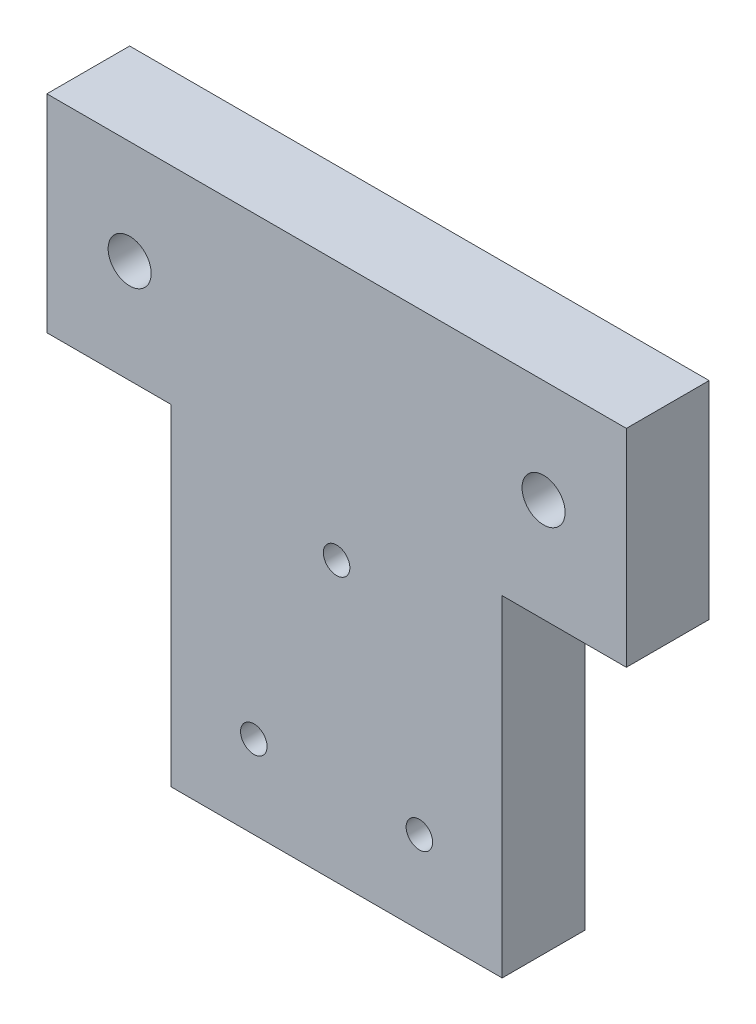
ISO-10303-21;
HEADER;
FILE_DESCRIPTION(('STEP AP214'),'2;1');
FILE_NAME('part.step','',(''),(''),'','','');
FILE_SCHEMA(('AUTOMOTIVE_DESIGN { 1 0 10303 214 1 1 1 1 }'));
ENDSEC;
DATA;
#1=APPLICATION_CONTEXT('core data for automotive mechanical design processes');
#2=APPLICATION_PROTOCOL_DEFINITION('international standard','automotive_design',2000,#1);
#3=PRODUCT_CONTEXT('',#1,'mechanical');
#4=PRODUCT('Part','Part','',(#3));
#5=PRODUCT_RELATED_PRODUCT_CATEGORY('part','',(#4));
#6=PRODUCT_DEFINITION_FORMATION('','',#4);
#7=PRODUCT_DEFINITION_CONTEXT('part definition',#1,'design');
#8=PRODUCT_DEFINITION('design','',#6,#7);
#9=PRODUCT_DEFINITION_SHAPE('','',#8);
#10=(LENGTH_UNIT() NAMED_UNIT(*) SI_UNIT(.MILLI.,.METRE.));
#11=(NAMED_UNIT(*) PLANE_ANGLE_UNIT() SI_UNIT($,.RADIAN.));
#12=(NAMED_UNIT(*) SI_UNIT($,.STERADIAN.) SOLID_ANGLE_UNIT());
#13=UNCERTAINTY_MEASURE_WITH_UNIT(LENGTH_MEASURE(1.E-05),#10,'distance_accuracy_value','');
#14=(GEOMETRIC_REPRESENTATION_CONTEXT(3) GLOBAL_UNCERTAINTY_ASSIGNED_CONTEXT((#13)) GLOBAL_UNIT_ASSIGNED_CONTEXT((#10,
#11,#12)) REPRESENTATION_CONTEXT('',''));
#15=CARTESIAN_POINT('',(0.,0.,0.));
#16=DIRECTION('',(0.,0.,1.));
#17=DIRECTION('',(1.,0.,0.));
#18=AXIS2_PLACEMENT_3D('',#15,#16,#17);
#19=CARTESIAN_POINT('',(-20.,-25.,10.));
#20=DIRECTION('',(1.,0.,0.));
#21=DIRECTION('',(0.,0.,-1.));
#22=AXIS2_PLACEMENT_3D('',#19,#20,#21);
#23=PLANE('',#22);
#24=DIRECTION('',(0.,-1.,0.));
#25=VECTOR('',#24,1.);
#26=CARTESIAN_POINT('',(-20.,-25.,0.));
#27=LINE('',#26,#25);
#28=CARTESIAN_POINT('',(-20.,-25.,0.));
#29=VERTEX_POINT('',#28);
#30=CARTESIAN_POINT('',(-20.,-65.,0.));
#31=VERTEX_POINT('',#30);
#32=EDGE_CURVE('E133',#29,#31,#27,.T.);
#33=ORIENTED_EDGE('',*,*,#32,.T.);
#34=DIRECTION('',(0.,0.,-1.));
#35=VECTOR('',#34,1.);
#36=CARTESIAN_POINT('',(-20.,-65.,10.));
#37=LINE('',#36,#35);
#38=CARTESIAN_POINT('',(-20.,-65.,10.));
#39=VERTEX_POINT('',#38);
#40=EDGE_CURVE('E11',#39,#31,#37,.T.);
#41=ORIENTED_EDGE('',*,*,#40,.F.);
#42=DIRECTION('',(0.,-1.,0.));
#43=VECTOR('',#42,1.);
#44=CARTESIAN_POINT('',(-20.,-25.,10.));
#45=LINE('',#44,#43);
#46=CARTESIAN_POINT('',(-20.,-25.,10.));
#47=VERTEX_POINT('',#46);
#48=EDGE_CURVE('E148',#47,#39,#45,.T.);
#49=ORIENTED_EDGE('',*,*,#48,.F.);
#50=DIRECTION('',(0.,0.,-1.));
#51=VECTOR('',#50,1.);
#52=CARTESIAN_POINT('',(-20.,-25.,10.));
#53=LINE('',#52,#51);
#54=EDGE_CURVE('E129',#47,#29,#53,.T.);
#55=ORIENTED_EDGE('',*,*,#54,.T.);
#56=EDGE_LOOP('',(#33,#41,#49,#55));
#57=FACE_BOUND('',#56,.T.);
#58=ADVANCED_FACE('F37',(#57),#23,.F.);
#59=CARTESIAN_POINT('',(20.,-65.,10.));
#60=DIRECTION('',(0.,1.,0.));
#61=DIRECTION('',(0.,0.,1.));
#62=AXIS2_PLACEMENT_3D('',#59,#60,#61);
#63=PLANE('',#62);
#64=DIRECTION('',(1.,0.,0.));
#65=VECTOR('',#64,1.);
#66=CARTESIAN_POINT('',(20.,-65.,0.));
#67=LINE('',#66,#65);
#68=CARTESIAN_POINT('',(20.,-65.,0.));
#69=VERTEX_POINT('',#68);
#70=EDGE_CURVE('E136',#31,#69,#67,.T.);
#71=ORIENTED_EDGE('',*,*,#70,.T.);
#72=DIRECTION('',(0.,0.,-1.));
#73=VECTOR('',#72,1.);
#74=CARTESIAN_POINT('',(20.,-65.,10.));
#75=LINE('',#74,#73);
#76=CARTESIAN_POINT('',(20.,-65.,10.));
#77=VERTEX_POINT('',#76);
#78=EDGE_CURVE('E45',#77,#69,#75,.T.);
#79=ORIENTED_EDGE('',*,*,#78,.F.);
#80=DIRECTION('',(1.,0.,0.));
#81=VECTOR('',#80,1.);
#82=CARTESIAN_POINT('',(20.,-65.,10.));
#83=LINE('',#82,#81);
#84=EDGE_CURVE('E96',#39,#77,#83,.T.);
#85=ORIENTED_EDGE('',*,*,#84,.F.);
#86=ORIENTED_EDGE('',*,*,#40,.T.);
#87=EDGE_LOOP('',(#71,#79,#85,#86));
#88=FACE_BOUND('',#87,.T.);
#89=ADVANCED_FACE('F241',(#88),#63,.F.);
#90=CARTESIAN_POINT('',(20.,-25.,10.));
#91=DIRECTION('',(-1.,0.,0.));
#92=DIRECTION('',(0.,0.,1.));
#93=AXIS2_PLACEMENT_3D('',#90,#91,#92);
#94=PLANE('',#93);
#95=DIRECTION('',(0.,1.,0.));
#96=VECTOR('',#95,1.);
#97=CARTESIAN_POINT('',(20.,-25.,0.));
#98=LINE('',#97,#96);
#99=CARTESIAN_POINT('',(20.,-25.,0.));
#100=VERTEX_POINT('',#99);
#101=EDGE_CURVE('E139',#69,#100,#98,.T.);
#102=ORIENTED_EDGE('',*,*,#101,.T.);
#103=DIRECTION('',(0.,0.,-1.));
#104=VECTOR('',#103,1.);
#105=CARTESIAN_POINT('',(20.,-25.,10.));
#106=LINE('',#105,#104);
#107=CARTESIAN_POINT('',(20.,-25.,10.));
#108=VERTEX_POINT('',#107);
#109=EDGE_CURVE('E155',#108,#100,#106,.T.);
#110=ORIENTED_EDGE('',*,*,#109,.F.);
#111=DIRECTION('',(0.,1.,0.));
#112=VECTOR('',#111,1.);
#113=CARTESIAN_POINT('',(20.,-25.,10.));
#114=LINE('',#113,#112);
#115=EDGE_CURVE('E163',#77,#108,#114,.T.);
#116=ORIENTED_EDGE('',*,*,#115,.F.);
#117=ORIENTED_EDGE('',*,*,#78,.T.);
#118=EDGE_LOOP('',(#102,#110,#116,#117));
#119=FACE_BOUND('',#118,.T.);
#120=ADVANCED_FACE('F161',(#119),#94,.F.);
#121=CARTESIAN_POINT('',(35.,-25.,10.));
#122=DIRECTION('',(0.,1.,0.));
#123=DIRECTION('',(-1.,0.,0.));
#124=AXIS2_PLACEMENT_3D('',#121,#122,#123);
#125=PLANE('',#124);
#126=DIRECTION('',(1.,0.,0.));
#127=VECTOR('',#126,1.);
#128=CARTESIAN_POINT('',(35.,-25.,0.));
#129=LINE('',#128,#127);
#130=CARTESIAN_POINT('',(35.,-25.,0.));
#131=VERTEX_POINT('',#130);
#132=EDGE_CURVE('E141',#100,#131,#129,.T.);
#133=ORIENTED_EDGE('',*,*,#132,.T.);
#134=DIRECTION('',(0.,0.,-1.));
#135=VECTOR('',#134,1.);
#136=CARTESIAN_POINT('',(35.,-25.,10.));
#137=LINE('',#136,#135);
#138=CARTESIAN_POINT('',(35.,-25.,10.));
#139=VERTEX_POINT('',#138);
#140=EDGE_CURVE('E152',#139,#131,#137,.T.);
#141=ORIENTED_EDGE('',*,*,#140,.F.);
#142=DIRECTION('',(1.,0.,0.));
#143=VECTOR('',#142,1.);
#144=CARTESIAN_POINT('',(35.,-25.,10.));
#145=LINE('',#144,#143);
#146=EDGE_CURVE('E175',#108,#139,#145,.T.);
#147=ORIENTED_EDGE('',*,*,#146,.F.);
#148=ORIENTED_EDGE('',*,*,#109,.T.);
#149=EDGE_LOOP('',(#133,#141,#147,#148));
#150=FACE_BOUND('',#149,.T.);
#151=ADVANCED_FACE('F171',(#150),#125,.F.);
#152=CARTESIAN_POINT('',(35.,0.,10.));
#153=DIRECTION('',(-1.,0.,0.));
#154=DIRECTION('',(0.,0.,1.));
#155=AXIS2_PLACEMENT_3D('',#152,#153,#154);
#156=PLANE('',#155);
#157=DIRECTION('',(0.,1.,0.));
#158=VECTOR('',#157,1.);
#159=CARTESIAN_POINT('',(35.,0.,0.));
#160=LINE('',#159,#158);
#161=CARTESIAN_POINT('',(35.,0.,0.));
#162=VERTEX_POINT('',#161);
#163=EDGE_CURVE('E143',#131,#162,#160,.T.);
#164=ORIENTED_EDGE('',*,*,#163,.T.);
#165=DIRECTION('',(0.,0.,-1.));
#166=VECTOR('',#165,1.);
#167=CARTESIAN_POINT('',(35.,0.,10.));
#168=LINE('',#167,#166);
#169=CARTESIAN_POINT('',(35.,0.,10.));
#170=VERTEX_POINT('',#169);
#171=EDGE_CURVE('E124',#170,#162,#168,.T.);
#172=ORIENTED_EDGE('',*,*,#171,.F.);
#173=DIRECTION('',(0.,1.,0.));
#174=VECTOR('',#173,1.);
#175=CARTESIAN_POINT('',(35.,0.,10.));
#176=LINE('',#175,#174);
#177=EDGE_CURVE('E115',#139,#170,#176,.T.);
#178=ORIENTED_EDGE('',*,*,#177,.F.);
#179=ORIENTED_EDGE('',*,*,#140,.T.);
#180=EDGE_LOOP('',(#164,#172,#178,#179));
#181=FACE_BOUND('',#180,.T.);
#182=ADVANCED_FACE('F174',(#181),#156,.F.);
#183=CARTESIAN_POINT('',(-35.,0.,10.));
#184=DIRECTION('',(0.,-1.,0.));
#185=DIRECTION('',(0.,0.,-1.));
#186=AXIS2_PLACEMENT_3D('',#183,#184,#185);
#187=PLANE('',#186);
#188=DIRECTION('',(-1.,0.,0.));
#189=VECTOR('',#188,1.);
#190=CARTESIAN_POINT('',(-35.,0.,0.));
#191=LINE('',#190,#189);
#192=CARTESIAN_POINT('',(-35.,0.,0.));
#193=VERTEX_POINT('',#192);
#194=EDGE_CURVE('E123',#162,#193,#191,.T.);
#195=ORIENTED_EDGE('',*,*,#194,.T.);
#196=DIRECTION('',(0.,0.,-1.));
#197=VECTOR('',#196,1.);
#198=CARTESIAN_POINT('',(-35.,0.,10.));
#199=LINE('',#198,#197);
#200=CARTESIAN_POINT('',(-35.,0.,10.));
#201=VERTEX_POINT('',#200);
#202=EDGE_CURVE('E120',#201,#193,#199,.T.);
#203=ORIENTED_EDGE('',*,*,#202,.F.);
#204=DIRECTION('',(-1.,0.,0.));
#205=VECTOR('',#204,1.);
#206=CARTESIAN_POINT('',(-35.,0.,10.));
#207=LINE('',#206,#205);
#208=EDGE_CURVE('E109',#170,#201,#207,.T.);
#209=ORIENTED_EDGE('',*,*,#208,.F.);
#210=ORIENTED_EDGE('',*,*,#171,.T.);
#211=EDGE_LOOP('',(#195,#203,#209,#210));
#212=FACE_BOUND('',#211,.T.);
#213=ADVANCED_FACE('F121',(#212),#187,.F.);
#214=CARTESIAN_POINT('',(-35.,0.,10.));
#215=DIRECTION('',(1.,0.,0.));
#216=DIRECTION('',(0.,0.,-1.));
#217=AXIS2_PLACEMENT_3D('',#214,#215,#216);
#218=PLANE('',#217);
#219=DIRECTION('',(0.,-1.,0.));
#220=VECTOR('',#219,1.);
#221=CARTESIAN_POINT('',(-35.,0.,0.));
#222=LINE('',#221,#220);
#223=CARTESIAN_POINT('',(-35.,-25.,0.));
#224=VERTEX_POINT('',#223);
#225=EDGE_CURVE('E82',#193,#224,#222,.T.);
#226=ORIENTED_EDGE('',*,*,#225,.T.);
#227=DIRECTION('',(0.,0.,-1.));
#228=VECTOR('',#227,1.);
#229=CARTESIAN_POINT('',(-35.,-25.,10.));
#230=LINE('',#229,#228);
#231=CARTESIAN_POINT('',(-35.,-25.,10.));
#232=VERTEX_POINT('',#231);
#233=EDGE_CURVE('E125',#232,#224,#230,.T.);
#234=ORIENTED_EDGE('',*,*,#233,.F.);
#235=DIRECTION('',(0.,-1.,0.));
#236=VECTOR('',#235,1.);
#237=CARTESIAN_POINT('',(-35.,0.,10.));
#238=LINE('',#237,#236);
#239=EDGE_CURVE('E113',#201,#232,#238,.T.);
#240=ORIENTED_EDGE('',*,*,#239,.F.);
#241=ORIENTED_EDGE('',*,*,#202,.T.);
#242=EDGE_LOOP('',(#226,#234,#240,#241));
#243=FACE_BOUND('',#242,.T.);
#244=ADVANCED_FACE('F127',(#243),#218,.F.);
#245=CARTESIAN_POINT('',(-35.,-25.,10.));
#246=DIRECTION('',(0.,1.,0.));
#247=DIRECTION('',(-1.,0.,0.));
#248=AXIS2_PLACEMENT_3D('',#245,#246,#247);
#249=PLANE('',#248);
#250=DIRECTION('',(1.,0.,0.));
#251=VECTOR('',#250,1.);
#252=CARTESIAN_POINT('',(-35.,-25.,0.));
#253=LINE('',#252,#251);
#254=EDGE_CURVE('E88',#224,#29,#253,.T.);
#255=ORIENTED_EDGE('',*,*,#254,.T.);
#256=ORIENTED_EDGE('',*,*,#54,.F.);
#257=DIRECTION('',(1.,0.,0.));
#258=VECTOR('',#257,1.);
#259=CARTESIAN_POINT('',(-35.,-25.,10.));
#260=LINE('',#259,#258);
#261=EDGE_CURVE('E53',#232,#47,#260,.T.);
#262=ORIENTED_EDGE('',*,*,#261,.F.);
#263=ORIENTED_EDGE('',*,*,#233,.T.);
#264=EDGE_LOOP('',(#255,#256,#262,#263));
#265=FACE_BOUND('',#264,.T.);
#266=ADVANCED_FACE('F216',(#265),#249,.F.);
#267=CARTESIAN_POINT('',(0.,0.,10.));
#268=DIRECTION('',(0.,0.,-1.));
#269=DIRECTION('',(-1.,0.,0.));
#270=AXIS2_PLACEMENT_3D('',#267,#268,#269);
#271=PLANE('',#270);
#272=CARTESIAN_POINT('',(-25.,-12.5,10.));
#273=DIRECTION('',(0.,0.,1.));
#274=DIRECTION('',(1.,0.,0.));
#275=AXIS2_PLACEMENT_3D('',#272,#273,#274);
#276=CIRCLE('',#275,2.6);
#277=CARTESIAN_POINT('',(-22.4,-12.5,10.));
#278=VERTEX_POINT('',#277);
#279=EDGE_CURVE('E202',#278,#278,#276,.T.);
#280=ORIENTED_EDGE('',*,*,#279,.F.);
#281=EDGE_LOOP('',(#280));
#282=FACE_BOUND('',#281,.T.);
#283=CARTESIAN_POINT('',(25.,-12.5,10.));
#284=DIRECTION('',(0.,0.,1.));
#285=DIRECTION('',(1.,0.,0.));
#286=AXIS2_PLACEMENT_3D('',#283,#284,#285);
#287=CIRCLE('',#286,2.6);
#288=CARTESIAN_POINT('',(27.6,-12.5,10.));
#289=VERTEX_POINT('',#288);
#290=EDGE_CURVE('E199',#289,#289,#287,.T.);
#291=ORIENTED_EDGE('',*,*,#290,.F.);
#292=EDGE_LOOP('',(#291));
#293=FACE_BOUND('',#292,.T.);
#294=CARTESIAN_POINT('',(0.,-31.3,10.));
#295=DIRECTION('',(0.,0.,-1.));
#296=DIRECTION('',(-1.,0.,0.));
#297=AXIS2_PLACEMENT_3D('',#294,#295,#296);
#298=CIRCLE('',#297,1.6);
#299=CARTESIAN_POINT('',(-1.6,-31.3,10.));
#300=VERTEX_POINT('',#299);
#301=EDGE_CURVE('E188',#300,#300,#298,.F.);
#302=ORIENTED_EDGE('',*,*,#301,.F.);
#303=EDGE_LOOP('',(#302));
#304=FACE_BOUND('',#303,.T.);
#305=CARTESIAN_POINT('',(-10.,-55.,10.));
#306=DIRECTION('',(0.,0.,-1.));
#307=DIRECTION('',(-1.,0.,0.));
#308=AXIS2_PLACEMENT_3D('',#305,#306,#307);
#309=CIRCLE('',#308,1.6);
#310=CARTESIAN_POINT('',(-11.6,-55.,10.));
#311=VERTEX_POINT('',#310);
#312=EDGE_CURVE('E137',#311,#311,#309,.F.);
#313=ORIENTED_EDGE('',*,*,#312,.F.);
#314=EDGE_LOOP('',(#313));
#315=FACE_BOUND('',#314,.T.);
#316=CARTESIAN_POINT('',(10.,-55.,10.));
#317=DIRECTION('',(0.,0.,-1.));
#318=DIRECTION('',(-1.,0.,0.));
#319=AXIS2_PLACEMENT_3D('',#316,#317,#318);
#320=CIRCLE('',#319,1.6);
#321=CARTESIAN_POINT('',(8.4,-55.,10.));
#322=VERTEX_POINT('',#321);
#323=EDGE_CURVE('E185',#322,#322,#320,.F.);
#324=ORIENTED_EDGE('',*,*,#323,.F.);
#325=EDGE_LOOP('',(#324));
#326=FACE_BOUND('',#325,.T.);
#327=ORIENTED_EDGE('',*,*,#48,.T.);
#328=ORIENTED_EDGE('',*,*,#84,.T.);
#329=ORIENTED_EDGE('',*,*,#115,.T.);
#330=ORIENTED_EDGE('',*,*,#146,.T.);
#331=ORIENTED_EDGE('',*,*,#177,.T.);
#332=ORIENTED_EDGE('',*,*,#208,.T.);
#333=ORIENTED_EDGE('',*,*,#239,.T.);
#334=ORIENTED_EDGE('',*,*,#261,.T.);
#335=EDGE_LOOP('',(#327,#328,#329,#330,#331,#332,#333,#334));
#336=FACE_BOUND('',#335,.T.);
#337=ADVANCED_FACE('F111',(#282,#293,#304,#315,#326,#336),#271,.F.);
#338=CARTESIAN_POINT('',(0.,0.,0.));
#339=DIRECTION('',(0.,0.,-1.));
#340=DIRECTION('',(-1.,0.,0.));
#341=AXIS2_PLACEMENT_3D('',#338,#339,#340);
#342=PLANE('',#341);
#343=CARTESIAN_POINT('',(-25.,-12.5,0.));
#344=DIRECTION('',(0.,0.,-1.));
#345=DIRECTION('',(-1.,0.,0.));
#346=AXIS2_PLACEMENT_3D('',#343,#344,#345);
#347=CIRCLE('',#346,2.6);
#348=CARTESIAN_POINT('',(-27.6,-12.5,0.));
#349=VERTEX_POINT('',#348);
#350=EDGE_CURVE('E198',#349,#349,#347,.F.);
#351=ORIENTED_EDGE('',*,*,#350,.T.);
#352=EDGE_LOOP('',(#351));
#353=FACE_BOUND('',#352,.T.);
#354=CARTESIAN_POINT('',(25.,-12.5,0.));
#355=DIRECTION('',(0.,0.,-1.));
#356=DIRECTION('',(-1.,0.,0.));
#357=AXIS2_PLACEMENT_3D('',#354,#355,#356);
#358=CIRCLE('',#357,2.6);
#359=CARTESIAN_POINT('',(22.4,-12.5,0.));
#360=VERTEX_POINT('',#359);
#361=EDGE_CURVE('E203',#360,#360,#358,.F.);
#362=ORIENTED_EDGE('',*,*,#361,.T.);
#363=EDGE_LOOP('',(#362));
#364=FACE_BOUND('',#363,.T.);
#365=CARTESIAN_POINT('',(0.,-31.3,0.));
#366=DIRECTION('',(0.,0.,-1.));
#367=DIRECTION('',(-1.,0.,0.));
#368=AXIS2_PLACEMENT_3D('',#365,#366,#367);
#369=CIRCLE('',#368,1.6);
#370=CARTESIAN_POINT('',(-1.6,-31.3,0.));
#371=VERTEX_POINT('',#370);
#372=EDGE_CURVE('E195',#371,#371,#369,.T.);
#373=ORIENTED_EDGE('',*,*,#372,.F.);
#374=EDGE_LOOP('',(#373));
#375=FACE_BOUND('',#374,.T.);
#376=CARTESIAN_POINT('',(-10.,-55.,0.));
#377=DIRECTION('',(0.,0.,-1.));
#378=DIRECTION('',(-1.,0.,0.));
#379=AXIS2_PLACEMENT_3D('',#376,#377,#378);
#380=CIRCLE('',#379,1.6);
#381=CARTESIAN_POINT('',(-11.6,-55.,0.));
#382=VERTEX_POINT('',#381);
#383=EDGE_CURVE('E184',#382,#382,#380,.T.);
#384=ORIENTED_EDGE('',*,*,#383,.F.);
#385=EDGE_LOOP('',(#384));
#386=FACE_BOUND('',#385,.T.);
#387=CARTESIAN_POINT('',(10.,-55.,0.));
#388=DIRECTION('',(0.,0.,-1.));
#389=DIRECTION('',(-1.,0.,0.));
#390=AXIS2_PLACEMENT_3D('',#387,#388,#389);
#391=CIRCLE('',#390,1.6);
#392=CARTESIAN_POINT('',(8.4,-55.,0.));
#393=VERTEX_POINT('',#392);
#394=EDGE_CURVE('E181',#393,#393,#391,.T.);
#395=ORIENTED_EDGE('',*,*,#394,.F.);
#396=EDGE_LOOP('',(#395));
#397=FACE_BOUND('',#396,.T.);
#398=ORIENTED_EDGE('',*,*,#32,.F.);
#399=ORIENTED_EDGE('',*,*,#254,.F.);
#400=ORIENTED_EDGE('',*,*,#225,.F.);
#401=ORIENTED_EDGE('',*,*,#194,.F.);
#402=ORIENTED_EDGE('',*,*,#163,.F.);
#403=ORIENTED_EDGE('',*,*,#132,.F.);
#404=ORIENTED_EDGE('',*,*,#101,.F.);
#405=ORIENTED_EDGE('',*,*,#70,.F.);
#406=EDGE_LOOP('',(#398,#399,#400,#401,#402,#403,#404,#405));
#407=FACE_BOUND('',#406,.T.);
#408=ADVANCED_FACE('F167',(#353,#364,#375,#386,#397,#407),#342,.T.);
#409=CARTESIAN_POINT('',(10.,-55.,14.5254833995939));
#410=DIRECTION('',(0.,0.,-1.));
#411=DIRECTION('',(-1.,0.,0.));
#412=AXIS2_PLACEMENT_3D('',#409,#410,#411);
#413=CYLINDRICAL_SURFACE('',#412,1.6);
#414=ORIENTED_EDGE('',*,*,#323,.T.);
#415=EDGE_LOOP('',(#414));
#416=FACE_BOUND('',#415,.T.);
#417=ORIENTED_EDGE('',*,*,#394,.T.);
#418=EDGE_LOOP('',(#417));
#419=FACE_BOUND('',#418,.T.);
#420=ADVANCED_FACE('F226',(#416,#419),#413,.F.);
#421=CARTESIAN_POINT('',(-10.,-55.,14.5254833995939));
#422=DIRECTION('',(0.,0.,-1.));
#423=DIRECTION('',(-1.,0.,0.));
#424=AXIS2_PLACEMENT_3D('',#421,#422,#423);
#425=CYLINDRICAL_SURFACE('',#424,1.6);
#426=ORIENTED_EDGE('',*,*,#312,.T.);
#427=EDGE_LOOP('',(#426));
#428=FACE_BOUND('',#427,.T.);
#429=ORIENTED_EDGE('',*,*,#383,.T.);
#430=EDGE_LOOP('',(#429));
#431=FACE_BOUND('',#430,.T.);
#432=ADVANCED_FACE('F229',(#428,#431),#425,.F.);
#433=CARTESIAN_POINT('',(0.,-31.3,14.5254833995939));
#434=DIRECTION('',(0.,0.,-1.));
#435=DIRECTION('',(-1.,0.,0.));
#436=AXIS2_PLACEMENT_3D('',#433,#434,#435);
#437=CYLINDRICAL_SURFACE('',#436,1.6);
#438=ORIENTED_EDGE('',*,*,#301,.T.);
#439=EDGE_LOOP('',(#438));
#440=FACE_BOUND('',#439,.T.);
#441=ORIENTED_EDGE('',*,*,#372,.T.);
#442=EDGE_LOOP('',(#441));
#443=FACE_BOUND('',#442,.T.);
#444=ADVANCED_FACE('F305',(#440,#443),#437,.F.);
#445=CARTESIAN_POINT('',(25.,-12.5,-7.35391052434011));
#446=DIRECTION('',(0.,0.,1.));
#447=DIRECTION('',(1.,0.,0.));
#448=AXIS2_PLACEMENT_3D('',#445,#446,#447);
#449=CYLINDRICAL_SURFACE('',#448,2.6);
#450=ORIENTED_EDGE('',*,*,#290,.T.);
#451=EDGE_LOOP('',(#450));
#452=FACE_BOUND('',#451,.T.);
#453=ORIENTED_EDGE('',*,*,#361,.F.);
#454=EDGE_LOOP('',(#453));
#455=FACE_BOUND('',#454,.T.);
#456=ADVANCED_FACE('F316',(#452,#455),#449,.F.);
#457=CARTESIAN_POINT('',(-25.,-12.5,-7.35391052434011));
#458=DIRECTION('',(0.,0.,1.));
#459=DIRECTION('',(1.,0.,0.));
#460=AXIS2_PLACEMENT_3D('',#457,#458,#459);
#461=CYLINDRICAL_SURFACE('',#460,2.6);
#462=ORIENTED_EDGE('',*,*,#279,.T.);
#463=EDGE_LOOP('',(#462));
#464=FACE_BOUND('',#463,.T.);
#465=ORIENTED_EDGE('',*,*,#350,.F.);
#466=EDGE_LOOP('',(#465));
#467=FACE_BOUND('',#466,.T.);
#468=ADVANCED_FACE('F211',(#464,#467),#461,.F.);
#469=CLOSED_SHELL('',(#58,#89,#120,#151,#182,#213,#244,#266,#337,#408,#420,#432,#444,#456,#468));
#470=MANIFOLD_SOLID_BREP('B2',#469);
#471=ADVANCED_BREP_SHAPE_REPRESENTATION('',(#18,#470),#14);
#472=SHAPE_DEFINITION_REPRESENTATION(#9,#471);
ENDSEC;
END-ISO-10303-21;
